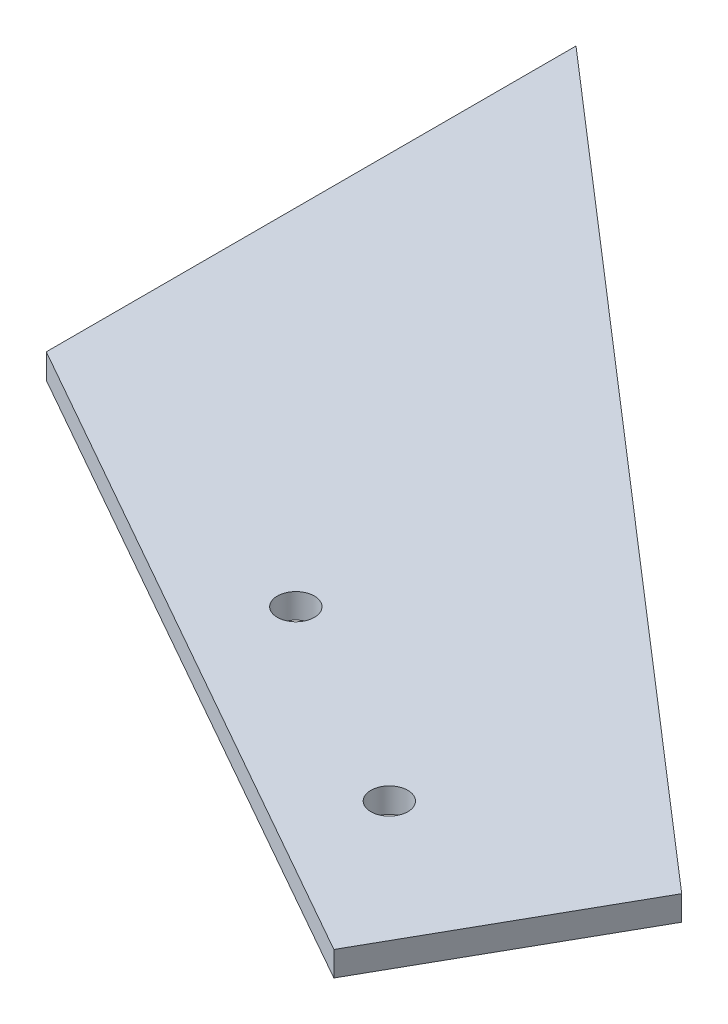
ISO-10303-21;
HEADER;
FILE_DESCRIPTION(('STEP AP214'),'2;1');
FILE_NAME('part.step','',(''),(''),'','','');
FILE_SCHEMA(('AUTOMOTIVE_DESIGN { 1 0 10303 214 1 1 1 1 }'));
ENDSEC;
DATA;
#1=APPLICATION_CONTEXT('core data for automotive mechanical design processes');
#2=APPLICATION_PROTOCOL_DEFINITION('international standard','automotive_design',2000,#1);
#3=PRODUCT_CONTEXT('',#1,'mechanical');
#4=PRODUCT('Part','Part','',(#3));
#5=PRODUCT_RELATED_PRODUCT_CATEGORY('part','',(#4));
#6=PRODUCT_DEFINITION_FORMATION('','',#4);
#7=PRODUCT_DEFINITION_CONTEXT('part definition',#1,'design');
#8=PRODUCT_DEFINITION('design','',#6,#7);
#9=PRODUCT_DEFINITION_SHAPE('','',#8);
#10=(LENGTH_UNIT() NAMED_UNIT(*) SI_UNIT(.MILLI.,.METRE.));
#11=(NAMED_UNIT(*) PLANE_ANGLE_UNIT() SI_UNIT($,.RADIAN.));
#12=(NAMED_UNIT(*) SI_UNIT($,.STERADIAN.) SOLID_ANGLE_UNIT());
#13=UNCERTAINTY_MEASURE_WITH_UNIT(LENGTH_MEASURE(1.E-05),#10,'distance_accuracy_value','');
#14=(GEOMETRIC_REPRESENTATION_CONTEXT(3) GLOBAL_UNCERTAINTY_ASSIGNED_CONTEXT((#13)) GLOBAL_UNIT_ASSIGNED_CONTEXT((#10,
#11,#12)) REPRESENTATION_CONTEXT('',''));
#15=CARTESIAN_POINT('',(0.,0.,0.));
#16=DIRECTION('',(0.,0.,1.));
#17=DIRECTION('',(1.,0.,0.));
#18=AXIS2_PLACEMENT_3D('',#15,#16,#17);
#19=CARTESIAN_POINT('',(186.14900255121,-20.99,1443.639994321));
#20=DIRECTION('',(0.,1.,0.));
#21=DIRECTION('',(0.87056898008277,0.,0.49204639102187));
#22=AXIS2_PLACEMENT_3D('',#19,#20,#21);
#23=CYLINDRICAL_SURFACE('',#22,4.5);
#24=CARTESIAN_POINT('',(186.14900255121,-25.,1443.639994321));
#25=DIRECTION('',(0.,1.,0.));
#26=DIRECTION('',(0.870568980082769,0.,0.49204639102187));
#27=AXIS2_PLACEMENT_3D('',#24,#25,#26);
#28=CIRCLE('',#27,4.5);
#29=CARTESIAN_POINT('',(190.06656296158,-25.,1445.85420308));
#30=VERTEX_POINT('',#29);
#31=EDGE_CURVE('E83',#30,#30,#28,.T.);
#32=ORIENTED_EDGE('',*,*,#31,.T.);
#33=DIRECTION('',(0.,-1.,0.));
#34=VECTOR('',#33,1.);
#35=CARTESIAN_POINT('',(190.06656296158,-20.99,1445.85420308));
#36=LINE('',#35,#34);
#37=CARTESIAN_POINT('',(190.06656296158,-31.,1445.85420308));
#38=VERTEX_POINT('',#37);
#39=EDGE_CURVE('E11',#30,#38,#36,.T.);
#40=ORIENTED_EDGE('',*,*,#39,.T.);
#41=CARTESIAN_POINT('',(186.14900255121,-31.,1443.639994321));
#42=DIRECTION('',(0.,1.,0.));
#43=DIRECTION('',(0.870568980082769,0.,0.49204639102187));
#44=AXIS2_PLACEMENT_3D('',#41,#42,#43);
#45=CIRCLE('',#44,4.5);
#46=EDGE_CURVE('E89',#38,#38,#45,.T.);
#47=ORIENTED_EDGE('',*,*,#46,.F.);
#48=ORIENTED_EDGE('',*,*,#39,.F.);
#49=EDGE_LOOP('',(#32,#40,#47,#48));
#50=FACE_BOUND('',#49,.T.);
#51=ADVANCED_FACE('F17',(#50),#23,.F.);
#52=CARTESIAN_POINT('',(133.91486374625,-20.99,1414.117210859));
#53=DIRECTION('',(0.,1.,0.));
#54=DIRECTION('',(0.87056898008277,0.,0.49204639102187));
#55=AXIS2_PLACEMENT_3D('',#52,#53,#54);
#56=CYLINDRICAL_SURFACE('',#55,4.5);
#57=CARTESIAN_POINT('',(133.91486374625,-25.,1414.117210859));
#58=DIRECTION('',(0.,1.,0.));
#59=DIRECTION('',(0.870568980082769,0.,0.49204639102187));
#60=AXIS2_PLACEMENT_3D('',#57,#58,#59);
#61=CIRCLE('',#60,4.5);
#62=CARTESIAN_POINT('',(137.83242415662,-25.,1416.331419619));
#63=VERTEX_POINT('',#62);
#64=EDGE_CURVE('E81',#63,#63,#61,.T.);
#65=ORIENTED_EDGE('',*,*,#64,.T.);
#66=DIRECTION('',(0.,-1.,0.));
#67=VECTOR('',#66,1.);
#68=CARTESIAN_POINT('',(137.83242415662,-20.99,1416.331419619));
#69=LINE('',#68,#67);
#70=CARTESIAN_POINT('',(137.83242415662,-31.,1416.331419619));
#71=VERTEX_POINT('',#70);
#72=EDGE_CURVE('E26',#63,#71,#69,.T.);
#73=ORIENTED_EDGE('',*,*,#72,.T.);
#74=CARTESIAN_POINT('',(133.91486374625,-31.,1414.117210859));
#75=DIRECTION('',(0.,1.,0.));
#76=DIRECTION('',(0.870568980082769,0.,0.49204639102187));
#77=AXIS2_PLACEMENT_3D('',#74,#75,#76);
#78=CIRCLE('',#77,4.5);
#79=EDGE_CURVE('E79',#71,#71,#78,.T.);
#80=ORIENTED_EDGE('',*,*,#79,.F.);
#81=ORIENTED_EDGE('',*,*,#72,.F.);
#82=EDGE_LOOP('',(#65,#73,#80,#81));
#83=FACE_BOUND('',#82,.T.);
#84=ADVANCED_FACE('F78',(#83),#56,.F.);
#85=CARTESIAN_POINT('',(241.14566378642,-25.,1427.628521778));
#86=DIRECTION('',(0.654500882424645,0.,-0.75606123753659));
#87=DIRECTION('',(0.,-1.,0.));
#88=AXIS2_PLACEMENT_3D('',#85,#86,#87);
#89=PLANE('',#88);
#90=DIRECTION('',(0.,-1.,0.));
#91=VECTOR('',#90,1.);
#92=CARTESIAN_POINT('',(241.14566378642,-25.,1427.628521778));
#93=LINE('',#92,#91);
#94=CARTESIAN_POINT('',(241.14566378642,-25.,1427.628521778));
#95=VERTEX_POINT('',#94);
#96=CARTESIAN_POINT('',(241.14566378642,-31.,1427.628521778));
#97=VERTEX_POINT('',#96);
#98=EDGE_CURVE('E95',#95,#97,#93,.T.);
#99=ORIENTED_EDGE('',*,*,#98,.T.);
#100=DIRECTION('',(-0.75606123753659,0.,-0.654500882424645));
#101=VECTOR('',#100,1.);
#102=CARTESIAN_POINT('',(241.14566378642,-31.,1427.628521778));
#103=LINE('',#102,#101);
#104=CARTESIAN_POINT('',(50.,-31.,1262.15911347));
#105=VERTEX_POINT('',#104);
#106=EDGE_CURVE('E99',#97,#105,#103,.T.);
#107=ORIENTED_EDGE('',*,*,#106,.T.);
#108=DIRECTION('',(0.,-1.,0.));
#109=VECTOR('',#108,1.);
#110=CARTESIAN_POINT('',(50.,-25.,1262.15911347));
#111=LINE('',#110,#109);
#112=CARTESIAN_POINT('',(50.,-25.,1262.15911347));
#113=VERTEX_POINT('',#112);
#114=EDGE_CURVE('E133',#113,#105,#111,.T.);
#115=ORIENTED_EDGE('',*,*,#114,.F.);
#116=DIRECTION('',(-0.75606123753659,0.,-0.654500882424645));
#117=VECTOR('',#116,1.);
#118=CARTESIAN_POINT('',(241.14566378642,-25.,1427.628521778));
#119=LINE('',#118,#117);
#120=EDGE_CURVE('E106',#95,#113,#119,.T.);
#121=ORIENTED_EDGE('',*,*,#120,.F.);
#122=EDGE_LOOP('',(#99,#107,#115,#121));
#123=FACE_BOUND('',#122,.T.);
#124=ADVANCED_FACE('F153',(#123),#89,.T.);
#125=CARTESIAN_POINT('',(129.4414266455,-25.,1378.785616639));
#126=DIRECTION('',(0.,1.,0.));
#127=DIRECTION('',(1.,0.,0.));
#128=AXIS2_PLACEMENT_3D('',#125,#126,#127);
#129=PLANE('',#128);
#130=ORIENTED_EDGE('',*,*,#31,.F.);
#131=EDGE_LOOP('',(#130));
#132=FACE_BOUND('',#131,.T.);
#133=ORIENTED_EDGE('',*,*,#64,.F.);
#134=EDGE_LOOP('',(#133));
#135=FACE_BOUND('',#134,.T.);
#136=DIRECTION('',(0.870568980082769,0.,0.49204639102187));
#137=VECTOR('',#136,1.);
#138=CARTESIAN_POINT('',(50.,-25.,1390.810607565));
#139=LINE('',#138,#137);
#140=CARTESIAN_POINT('',(50.,-25.,1390.810607565));
#141=VERTEX_POINT('',#140);
#142=CARTESIAN_POINT('',(210.63878754305,-25.,1481.603798543));
#143=VERTEX_POINT('',#142);
#144=EDGE_CURVE('E137',#141,#143,#139,.T.);
#145=ORIENTED_EDGE('',*,*,#144,.T.);
#146=DIRECTION('',(0.49204639102187,0.,-0.870568980082769));
#147=VECTOR('',#146,1.);
#148=CARTESIAN_POINT('',(210.63878754305,-25.,1481.603798543));
#149=LINE('',#148,#147);
#150=EDGE_CURVE('E103',#143,#95,#149,.T.);
#151=ORIENTED_EDGE('',*,*,#150,.T.);
#152=ORIENTED_EDGE('',*,*,#120,.T.);
#153=DIRECTION('',(0.,0.,1.));
#154=VECTOR('',#153,1.);
#155=CARTESIAN_POINT('',(50.,-25.,1262.15911347));
#156=LINE('',#155,#154);
#157=EDGE_CURVE('E132',#113,#141,#156,.T.);
#158=ORIENTED_EDGE('',*,*,#157,.T.);
#159=EDGE_LOOP('',(#145,#151,#152,#158));
#160=FACE_BOUND('',#159,.T.);
#161=ADVANCED_FACE('F159',(#132,#135,#160),#129,.T.);
#162=CARTESIAN_POINT('',(210.63878754305,-25.,1481.603798543));
#163=DIRECTION('',(0.870568980082769,0.,0.49204639102187));
#164=DIRECTION('',(0.,-1.,0.));
#165=AXIS2_PLACEMENT_3D('',#162,#163,#164);
#166=PLANE('',#165);
#167=DIRECTION('',(0.,-1.,0.));
#168=VECTOR('',#167,1.);
#169=CARTESIAN_POINT('',(210.63878754305,-25.,1481.603798543));
#170=LINE('',#169,#168);
#171=CARTESIAN_POINT('',(210.63878754305,-31.,1481.603798543));
#172=VERTEX_POINT('',#171);
#173=EDGE_CURVE('E128',#143,#172,#170,.T.);
#174=ORIENTED_EDGE('',*,*,#173,.T.);
#175=DIRECTION('',(0.49204639102187,0.,-0.870568980082769));
#176=VECTOR('',#175,1.);
#177=CARTESIAN_POINT('',(210.63878754305,-31.,1481.603798543));
#178=LINE('',#177,#176);
#179=EDGE_CURVE('E90',#172,#97,#178,.T.);
#180=ORIENTED_EDGE('',*,*,#179,.T.);
#181=ORIENTED_EDGE('',*,*,#98,.F.);
#182=ORIENTED_EDGE('',*,*,#150,.F.);
#183=EDGE_LOOP('',(#174,#180,#181,#182));
#184=FACE_BOUND('',#183,.T.);
#185=ADVANCED_FACE('F164',(#184),#166,.T.);
#186=CARTESIAN_POINT('',(129.4414266455,-31.,1378.785616639));
#187=DIRECTION('',(0.,1.,0.));
#188=DIRECTION('',(1.,0.,0.));
#189=AXIS2_PLACEMENT_3D('',#186,#187,#188);
#190=PLANE('',#189);
#191=ORIENTED_EDGE('',*,*,#46,.T.);
#192=EDGE_LOOP('',(#191));
#193=FACE_BOUND('',#192,.T.);
#194=ORIENTED_EDGE('',*,*,#79,.T.);
#195=EDGE_LOOP('',(#194));
#196=FACE_BOUND('',#195,.T.);
#197=DIRECTION('',(0.,0.,1.));
#198=VECTOR('',#197,1.);
#199=CARTESIAN_POINT('',(50.,-31.,1262.15911347));
#200=LINE('',#199,#198);
#201=CARTESIAN_POINT('',(50.,-31.,1390.810607565));
#202=VERTEX_POINT('',#201);
#203=EDGE_CURVE('E129',#105,#202,#200,.T.);
#204=ORIENTED_EDGE('',*,*,#203,.F.);
#205=ORIENTED_EDGE('',*,*,#106,.F.);
#206=ORIENTED_EDGE('',*,*,#179,.F.);
#207=DIRECTION('',(0.870568980082769,0.,0.49204639102187));
#208=VECTOR('',#207,1.);
#209=CARTESIAN_POINT('',(50.,-31.,1390.810607565));
#210=LINE('',#209,#208);
#211=EDGE_CURVE('E124',#202,#172,#210,.T.);
#212=ORIENTED_EDGE('',*,*,#211,.F.);
#213=EDGE_LOOP('',(#204,#205,#206,#212));
#214=FACE_BOUND('',#213,.T.);
#215=ADVANCED_FACE('F86',(#193,#196,#214),#190,.F.);
#216=CARTESIAN_POINT('',(50.,-25.,1262.15911347));
#217=DIRECTION('',(-1.,0.,0.));
#218=DIRECTION('',(0.,0.,1.));
#219=AXIS2_PLACEMENT_3D('',#216,#217,#218);
#220=PLANE('',#219);
#221=ORIENTED_EDGE('',*,*,#114,.T.);
#222=ORIENTED_EDGE('',*,*,#203,.T.);
#223=DIRECTION('',(0.,-1.,0.));
#224=VECTOR('',#223,1.);
#225=CARTESIAN_POINT('',(50.,-25.,1390.810607565));
#226=LINE('',#225,#224);
#227=EDGE_CURVE('E121',#141,#202,#226,.T.);
#228=ORIENTED_EDGE('',*,*,#227,.F.);
#229=ORIENTED_EDGE('',*,*,#157,.F.);
#230=EDGE_LOOP('',(#221,#222,#228,#229));
#231=FACE_BOUND('',#230,.T.);
#232=ADVANCED_FACE('F157',(#231),#220,.T.);
#233=CARTESIAN_POINT('',(50.,-25.,1390.810607565));
#234=DIRECTION('',(-0.49204639102187,0.,0.870568980082769));
#235=DIRECTION('',(0.,1.,0.));
#236=AXIS2_PLACEMENT_3D('',#233,#234,#235);
#237=PLANE('',#236);
#238=ORIENTED_EDGE('',*,*,#227,.T.);
#239=ORIENTED_EDGE('',*,*,#211,.T.);
#240=ORIENTED_EDGE('',*,*,#173,.F.);
#241=ORIENTED_EDGE('',*,*,#144,.F.);
#242=EDGE_LOOP('',(#238,#239,#240,#241));
#243=FACE_BOUND('',#242,.T.);
#244=ADVANCED_FACE('F162',(#243),#237,.T.);
#245=CLOSED_SHELL('',(#51,#84,#124,#161,#185,#215,#232,#244));
#246=MANIFOLD_SOLID_BREP('B1',#245);
#247=ADVANCED_BREP_SHAPE_REPRESENTATION('',(#18,#246),#14);
#248=SHAPE_DEFINITION_REPRESENTATION(#9,#247);
ENDSEC;
END-ISO-10303-21;
